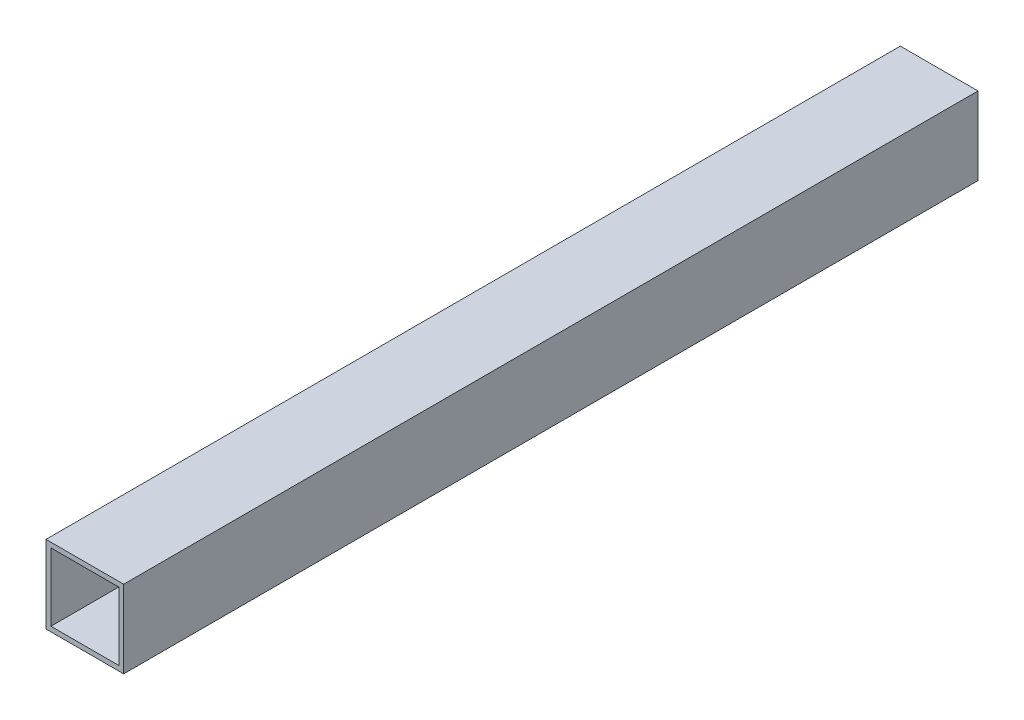
ISO-10303-21;
HEADER;
FILE_DESCRIPTION(('STEP AP214'),'2;1');
FILE_NAME('part.step','',(''),(''),'','','');
FILE_SCHEMA(('AUTOMOTIVE_DESIGN { 1 0 10303 214 1 1 1 1 }'));
ENDSEC;
DATA;
#1=APPLICATION_CONTEXT('core data for automotive mechanical design processes');
#2=APPLICATION_PROTOCOL_DEFINITION('international standard','automotive_design',2000,#1);
#3=PRODUCT_CONTEXT('',#1,'mechanical');
#4=PRODUCT('Part','Part','',(#3));
#5=PRODUCT_RELATED_PRODUCT_CATEGORY('part','',(#4));
#6=PRODUCT_DEFINITION_FORMATION('','',#4);
#7=PRODUCT_DEFINITION_CONTEXT('part definition',#1,'design');
#8=PRODUCT_DEFINITION('design','',#6,#7);
#9=PRODUCT_DEFINITION_SHAPE('','',#8);
#10=(LENGTH_UNIT() NAMED_UNIT(*) SI_UNIT(.MILLI.,.METRE.));
#11=(NAMED_UNIT(*) PLANE_ANGLE_UNIT() SI_UNIT($,.RADIAN.));
#12=(NAMED_UNIT(*) SI_UNIT($,.STERADIAN.) SOLID_ANGLE_UNIT());
#13=UNCERTAINTY_MEASURE_WITH_UNIT(LENGTH_MEASURE(1.E-05),#10,'distance_accuracy_value','');
#14=(GEOMETRIC_REPRESENTATION_CONTEXT(3) GLOBAL_UNCERTAINTY_ASSIGNED_CONTEXT((#13)) GLOBAL_UNIT_ASSIGNED_CONTEXT((#10,
#11,#12)) REPRESENTATION_CONTEXT('',''));
#15=CARTESIAN_POINT('',(0.,0.,0.));
#16=DIRECTION('',(0.,0.,1.));
#17=DIRECTION('',(1.,0.,0.));
#18=AXIS2_PLACEMENT_3D('',#15,#16,#17);
#19=CARTESIAN_POINT('',(-12.7,12.7,279.4));
#20=DIRECTION('',(0.,1.,0.));
#21=DIRECTION('',(0.,0.,1.));
#22=AXIS2_PLACEMENT_3D('',#19,#20,#21);
#23=PLANE('',#22);
#24=DIRECTION('',(1.,0.,0.));
#25=VECTOR('',#24,1.);
#26=CARTESIAN_POINT('',(-12.7,12.7,0.));
#27=LINE('',#26,#25);
#28=CARTESIAN_POINT('',(-12.7,12.7,0.));
#29=VERTEX_POINT('',#28);
#30=CARTESIAN_POINT('',(12.7,12.7,0.));
#31=VERTEX_POINT('',#30);
#32=EDGE_CURVE('E142',#29,#31,#27,.T.);
#33=ORIENTED_EDGE('',*,*,#32,.F.);
#34=DIRECTION('',(0.,0.,-1.));
#35=VECTOR('',#34,1.);
#36=CARTESIAN_POINT('',(-12.7,12.7,279.4));
#37=LINE('',#36,#35);
#38=CARTESIAN_POINT('',(-12.7,12.7,279.4));
#39=VERTEX_POINT('',#38);
#40=EDGE_CURVE('E12',#39,#29,#37,.T.);
#41=ORIENTED_EDGE('',*,*,#40,.F.);
#42=DIRECTION('',(1.,0.,0.));
#43=VECTOR('',#42,1.);
#44=CARTESIAN_POINT('',(-12.7,12.7,279.4));
#45=LINE('',#44,#43);
#46=CARTESIAN_POINT('',(12.7,12.7,279.4));
#47=VERTEX_POINT('',#46);
#48=EDGE_CURVE('E171',#39,#47,#45,.T.);
#49=ORIENTED_EDGE('',*,*,#48,.T.);
#50=DIRECTION('',(0.,0.,-1.));
#51=VECTOR('',#50,1.);
#52=CARTESIAN_POINT('',(12.7,12.7,279.4));
#53=LINE('',#52,#51);
#54=EDGE_CURVE('E72',#47,#31,#53,.T.);
#55=ORIENTED_EDGE('',*,*,#54,.T.);
#56=EDGE_LOOP('',(#33,#41,#49,#55));
#57=FACE_BOUND('',#56,.T.);
#58=ADVANCED_FACE('F69',(#57),#23,.T.);
#59=CARTESIAN_POINT('',(-12.7,-12.7,279.4));
#60=DIRECTION('',(-1.,0.,0.));
#61=DIRECTION('',(0.,0.,1.));
#62=AXIS2_PLACEMENT_3D('',#59,#60,#61);
#63=PLANE('',#62);
#64=DIRECTION('',(0.,1.,0.));
#65=VECTOR('',#64,1.);
#66=CARTESIAN_POINT('',(-12.7,-12.7,0.));
#67=LINE('',#66,#65);
#68=CARTESIAN_POINT('',(-12.7,-12.7,0.));
#69=VERTEX_POINT('',#68);
#70=EDGE_CURVE('E175',#69,#29,#67,.T.);
#71=ORIENTED_EDGE('',*,*,#70,.F.);
#72=DIRECTION('',(0.,0.,-1.));
#73=VECTOR('',#72,1.);
#74=CARTESIAN_POINT('',(-12.7,-12.7,279.4));
#75=LINE('',#74,#73);
#76=CARTESIAN_POINT('',(-12.7,-12.7,279.4));
#77=VERTEX_POINT('',#76);
#78=EDGE_CURVE('E77',#77,#69,#75,.T.);
#79=ORIENTED_EDGE('',*,*,#78,.F.);
#80=DIRECTION('',(0.,1.,0.));
#81=VECTOR('',#80,1.);
#82=CARTESIAN_POINT('',(-12.7,-12.7,279.4));
#83=LINE('',#82,#81);
#84=EDGE_CURVE('E179',#77,#39,#83,.T.);
#85=ORIENTED_EDGE('',*,*,#84,.T.);
#86=ORIENTED_EDGE('',*,*,#40,.T.);
#87=EDGE_LOOP('',(#71,#79,#85,#86));
#88=FACE_BOUND('',#87,.T.);
#89=ADVANCED_FACE('F207',(#88),#63,.T.);
#90=CARTESIAN_POINT('',(-12.7,-12.7,279.4));
#91=DIRECTION('',(0.,1.,0.));
#92=DIRECTION('',(0.,0.,1.));
#93=AXIS2_PLACEMENT_3D('',#90,#91,#92);
#94=PLANE('',#93);
#95=DIRECTION('',(1.,0.,0.));
#96=VECTOR('',#95,1.);
#97=CARTESIAN_POINT('',(-12.7,-12.7,0.));
#98=LINE('',#97,#96);
#99=CARTESIAN_POINT('',(12.7,-12.7,0.));
#100=VERTEX_POINT('',#99);
#101=EDGE_CURVE('E187',#69,#100,#98,.T.);
#102=ORIENTED_EDGE('',*,*,#101,.T.);
#103=DIRECTION('',(0.,0.,-1.));
#104=VECTOR('',#103,1.);
#105=CARTESIAN_POINT('',(12.7,-12.7,279.4));
#106=LINE('',#105,#104);
#107=CARTESIAN_POINT('',(12.7,-12.7,279.4));
#108=VERTEX_POINT('',#107);
#109=EDGE_CURVE('E191',#108,#100,#106,.T.);
#110=ORIENTED_EDGE('',*,*,#109,.F.);
#111=DIRECTION('',(1.,0.,0.));
#112=VECTOR('',#111,1.);
#113=CARTESIAN_POINT('',(-12.7,-12.7,279.4));
#114=LINE('',#113,#112);
#115=EDGE_CURVE('E177',#77,#108,#114,.T.);
#116=ORIENTED_EDGE('',*,*,#115,.F.);
#117=ORIENTED_EDGE('',*,*,#78,.T.);
#118=EDGE_LOOP('',(#102,#110,#116,#117));
#119=FACE_BOUND('',#118,.T.);
#120=ADVANCED_FACE('F211',(#119),#94,.F.);
#121=CARTESIAN_POINT('',(12.7,-12.7,279.4));
#122=DIRECTION('',(-1.,0.,0.));
#123=DIRECTION('',(0.,0.,1.));
#124=AXIS2_PLACEMENT_3D('',#121,#122,#123);
#125=PLANE('',#124);
#126=DIRECTION('',(0.,1.,0.));
#127=VECTOR('',#126,1.);
#128=CARTESIAN_POINT('',(12.7,-12.7,0.));
#129=LINE('',#128,#127);
#130=EDGE_CURVE('E184',#100,#31,#129,.T.);
#131=ORIENTED_EDGE('',*,*,#130,.T.);
#132=ORIENTED_EDGE('',*,*,#54,.F.);
#133=DIRECTION('',(0.,1.,0.));
#134=VECTOR('',#133,1.);
#135=CARTESIAN_POINT('',(12.7,-12.7,279.4));
#136=LINE('',#135,#134);
#137=EDGE_CURVE('E174',#108,#47,#136,.T.);
#138=ORIENTED_EDGE('',*,*,#137,.F.);
#139=ORIENTED_EDGE('',*,*,#109,.T.);
#140=EDGE_LOOP('',(#131,#132,#138,#139));
#141=FACE_BOUND('',#140,.T.);
#142=ADVANCED_FACE('F201',(#141),#125,.F.);
#143=CARTESIAN_POINT('',(0.,0.,279.4));
#144=DIRECTION('',(0.,0.,1.));
#145=DIRECTION('',(1.,0.,0.));
#146=AXIS2_PLACEMENT_3D('',#143,#144,#145);
#147=PLANE('',#146);
#148=DIRECTION('',(0.,1.,0.));
#149=VECTOR('',#148,1.);
#150=CARTESIAN_POINT('',(-11.0998,0.,279.4));
#151=LINE('',#150,#149);
#152=CARTESIAN_POINT('',(-11.0998,-11.0998,279.4));
#153=VERTEX_POINT('',#152);
#154=CARTESIAN_POINT('',(-11.0998,11.0998,279.4));
#155=VERTEX_POINT('',#154);
#156=EDGE_CURVE('E146',#153,#155,#151,.T.);
#157=ORIENTED_EDGE('',*,*,#156,.T.);
#158=DIRECTION('',(1.,0.,0.));
#159=VECTOR('',#158,1.);
#160=CARTESIAN_POINT('',(0.,11.0998,279.4));
#161=LINE('',#160,#159);
#162=CARTESIAN_POINT('',(11.0998,11.0998,279.4));
#163=VERTEX_POINT('',#162);
#164=EDGE_CURVE('E158',#155,#163,#161,.T.);
#165=ORIENTED_EDGE('',*,*,#164,.T.);
#166=DIRECTION('',(0.,1.,0.));
#167=VECTOR('',#166,1.);
#168=CARTESIAN_POINT('',(11.0998,0.,279.4));
#169=LINE('',#168,#167);
#170=CARTESIAN_POINT('',(11.0998,-11.0998,279.4));
#171=VERTEX_POINT('',#170);
#172=EDGE_CURVE('E156',#171,#163,#169,.T.);
#173=ORIENTED_EDGE('',*,*,#172,.F.);
#174=DIRECTION('',(1.,0.,0.));
#175=VECTOR('',#174,1.);
#176=CARTESIAN_POINT('',(0.,-11.0998,279.4));
#177=LINE('',#176,#175);
#178=EDGE_CURVE('E138',#153,#171,#177,.T.);
#179=ORIENTED_EDGE('',*,*,#178,.F.);
#180=EDGE_LOOP('',(#157,#165,#173,#179));
#181=FACE_BOUND('',#180,.T.);
#182=ORIENTED_EDGE('',*,*,#48,.F.);
#183=ORIENTED_EDGE('',*,*,#84,.F.);
#184=ORIENTED_EDGE('',*,*,#115,.T.);
#185=ORIENTED_EDGE('',*,*,#137,.T.);
#186=EDGE_LOOP('',(#182,#183,#184,#185));
#187=FACE_BOUND('',#186,.T.);
#188=ADVANCED_FACE('F154',(#181,#187),#147,.T.);
#189=CARTESIAN_POINT('',(0.,0.,0.));
#190=DIRECTION('',(0.,0.,1.));
#191=DIRECTION('',(1.,0.,0.));
#192=AXIS2_PLACEMENT_3D('',#189,#190,#191);
#193=PLANE('',#192);
#194=DIRECTION('',(1.,0.,0.));
#195=VECTOR('',#194,1.);
#196=CARTESIAN_POINT('',(0.,11.0998,0.));
#197=LINE('',#196,#195);
#198=CARTESIAN_POINT('',(-11.0998,11.0998,0.));
#199=VERTEX_POINT('',#198);
#200=CARTESIAN_POINT('',(11.0998,11.0998,0.));
#201=VERTEX_POINT('',#200);
#202=EDGE_CURVE('E151',#199,#201,#197,.T.);
#203=ORIENTED_EDGE('',*,*,#202,.F.);
#204=DIRECTION('',(0.,1.,0.));
#205=VECTOR('',#204,1.);
#206=CARTESIAN_POINT('',(-11.0998,0.,0.));
#207=LINE('',#206,#205);
#208=CARTESIAN_POINT('',(-11.0998,-11.0998,0.));
#209=VERTEX_POINT('',#208);
#210=EDGE_CURVE('E93',#209,#199,#207,.T.);
#211=ORIENTED_EDGE('',*,*,#210,.F.);
#212=DIRECTION('',(1.,0.,0.));
#213=VECTOR('',#212,1.);
#214=CARTESIAN_POINT('',(0.,-11.0998,0.));
#215=LINE('',#214,#213);
#216=CARTESIAN_POINT('',(11.0998,-11.0998,0.));
#217=VERTEX_POINT('',#216);
#218=EDGE_CURVE('E141',#209,#217,#215,.T.);
#219=ORIENTED_EDGE('',*,*,#218,.T.);
#220=DIRECTION('',(0.,1.,0.));
#221=VECTOR('',#220,1.);
#222=CARTESIAN_POINT('',(11.0998,0.,0.));
#223=LINE('',#222,#221);
#224=EDGE_CURVE('E164',#217,#201,#223,.T.);
#225=ORIENTED_EDGE('',*,*,#224,.T.);
#226=EDGE_LOOP('',(#203,#211,#219,#225));
#227=FACE_BOUND('',#226,.T.);
#228=ORIENTED_EDGE('',*,*,#32,.T.);
#229=ORIENTED_EDGE('',*,*,#130,.F.);
#230=ORIENTED_EDGE('',*,*,#101,.F.);
#231=ORIENTED_EDGE('',*,*,#70,.T.);
#232=EDGE_LOOP('',(#228,#229,#230,#231));
#233=FACE_BOUND('',#232,.T.);
#234=ADVANCED_FACE('F204',(#227,#233),#193,.F.);
#235=CARTESIAN_POINT('',(-11.0998,0.,279.4));
#236=DIRECTION('',(-1.,0.,0.));
#237=DIRECTION('',(0.,0.,1.));
#238=AXIS2_PLACEMENT_3D('',#235,#236,#237);
#239=PLANE('',#238);
#240=ORIENTED_EDGE('',*,*,#210,.T.);
#241=DIRECTION('',(0.,0.,-1.));
#242=VECTOR('',#241,1.);
#243=CARTESIAN_POINT('',(-11.0998,11.0998,279.4));
#244=LINE('',#243,#242);
#245=EDGE_CURVE('E148',#155,#199,#244,.T.);
#246=ORIENTED_EDGE('',*,*,#245,.F.);
#247=ORIENTED_EDGE('',*,*,#156,.F.);
#248=DIRECTION('',(0.,0.,-1.));
#249=VECTOR('',#248,1.);
#250=CARTESIAN_POINT('',(-11.0998,-11.0998,279.4));
#251=LINE('',#250,#249);
#252=EDGE_CURVE('E134',#153,#209,#251,.T.);
#253=ORIENTED_EDGE('',*,*,#252,.T.);
#254=EDGE_LOOP('',(#240,#246,#247,#253));
#255=FACE_BOUND('',#254,.T.);
#256=ADVANCED_FACE('F147',(#255),#239,.F.);
#257=CARTESIAN_POINT('',(0.,-11.0998,279.4));
#258=DIRECTION('',(0.,1.,0.));
#259=DIRECTION('',(0.,0.,1.));
#260=AXIS2_PLACEMENT_3D('',#257,#258,#259);
#261=PLANE('',#260);
#262=ORIENTED_EDGE('',*,*,#218,.F.);
#263=ORIENTED_EDGE('',*,*,#252,.F.);
#264=ORIENTED_EDGE('',*,*,#178,.T.);
#265=DIRECTION('',(0.,0.,-1.));
#266=VECTOR('',#265,1.);
#267=CARTESIAN_POINT('',(11.0998,-11.0998,279.4));
#268=LINE('',#267,#266);
#269=EDGE_CURVE('E143',#171,#217,#268,.T.);
#270=ORIENTED_EDGE('',*,*,#269,.T.);
#271=EDGE_LOOP('',(#262,#263,#264,#270));
#272=FACE_BOUND('',#271,.T.);
#273=ADVANCED_FACE('F136',(#272),#261,.T.);
#274=CARTESIAN_POINT('',(11.0998,0.,279.4));
#275=DIRECTION('',(-1.,0.,0.));
#276=DIRECTION('',(0.,0.,1.));
#277=AXIS2_PLACEMENT_3D('',#274,#275,#276);
#278=PLANE('',#277);
#279=ORIENTED_EDGE('',*,*,#224,.F.);
#280=ORIENTED_EDGE('',*,*,#269,.F.);
#281=ORIENTED_EDGE('',*,*,#172,.T.);
#282=DIRECTION('',(0.,0.,-1.));
#283=VECTOR('',#282,1.);
#284=CARTESIAN_POINT('',(11.0998,11.0998,279.4));
#285=LINE('',#284,#283);
#286=EDGE_CURVE('E85',#163,#201,#285,.T.);
#287=ORIENTED_EDGE('',*,*,#286,.T.);
#288=EDGE_LOOP('',(#279,#280,#281,#287));
#289=FACE_BOUND('',#288,.T.);
#290=ADVANCED_FACE('F272',(#289),#278,.T.);
#291=CARTESIAN_POINT('',(0.,11.0998,279.4));
#292=DIRECTION('',(0.,1.,0.));
#293=DIRECTION('',(0.,0.,1.));
#294=AXIS2_PLACEMENT_3D('',#291,#292,#293);
#295=PLANE('',#294);
#296=ORIENTED_EDGE('',*,*,#202,.T.);
#297=ORIENTED_EDGE('',*,*,#286,.F.);
#298=ORIENTED_EDGE('',*,*,#164,.F.);
#299=ORIENTED_EDGE('',*,*,#245,.T.);
#300=EDGE_LOOP('',(#296,#297,#298,#299));
#301=FACE_BOUND('',#300,.T.);
#302=ADVANCED_FACE('F281',(#301),#295,.F.);
#303=CLOSED_SHELL('',(#58,#89,#120,#142,#188,#234,#256,#273,#290,#302));
#304=MANIFOLD_SOLID_BREP('B2',#303);
#305=ADVANCED_BREP_SHAPE_REPRESENTATION('',(#18,#304),#14);
#306=SHAPE_DEFINITION_REPRESENTATION(#9,#305);
ENDSEC;
END-ISO-10303-21;
